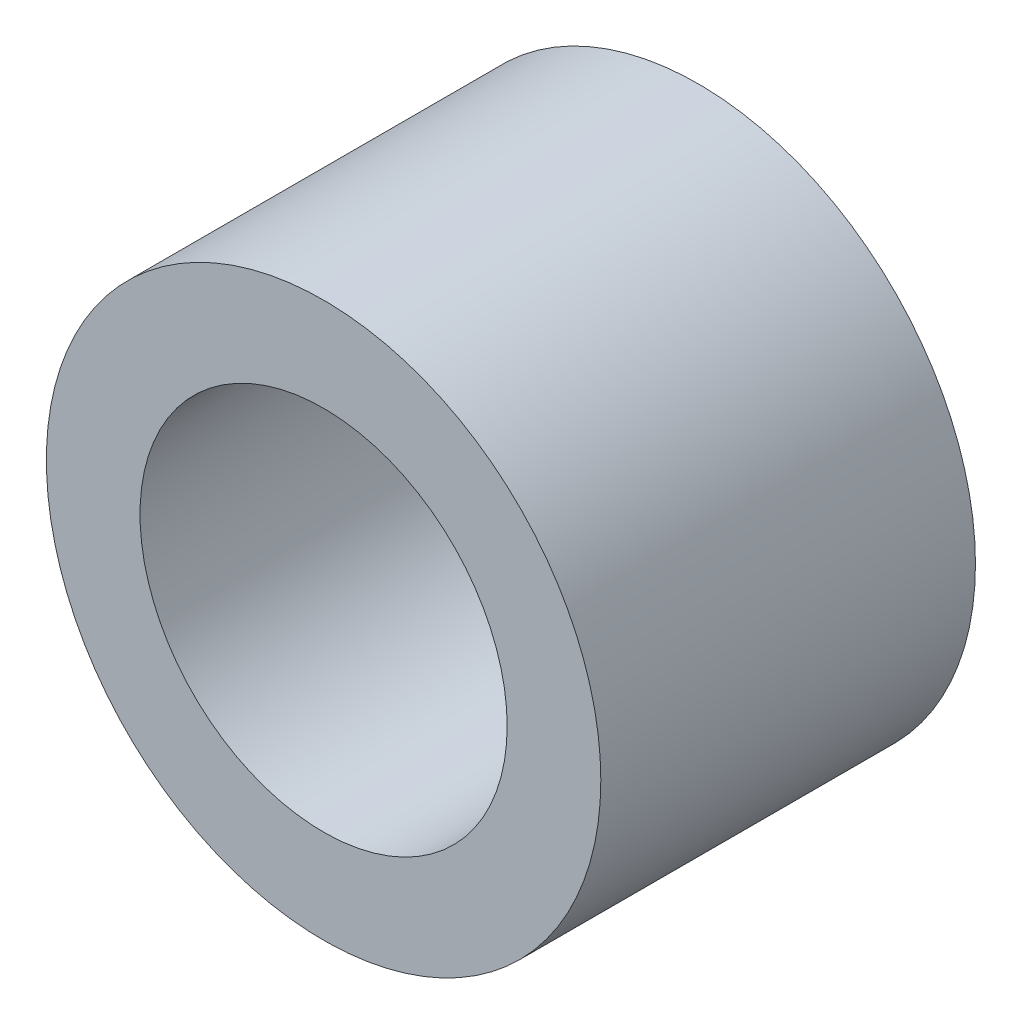
ISO-10303-21;
HEADER;
FILE_DESCRIPTION(('STEP AP214'),'2;1');
FILE_NAME('part.step','',(''),(''),'','','');
FILE_SCHEMA(('AUTOMOTIVE_DESIGN { 1 0 10303 214 1 1 1 1 }'));
ENDSEC;
DATA;
#1=APPLICATION_CONTEXT('core data for automotive mechanical design processes');
#2=APPLICATION_PROTOCOL_DEFINITION('international standard','automotive_design',2000,#1);
#3=PRODUCT_CONTEXT('',#1,'mechanical');
#4=PRODUCT('Part','Part','',(#3));
#5=PRODUCT_RELATED_PRODUCT_CATEGORY('part','',(#4));
#6=PRODUCT_DEFINITION_FORMATION('','',#4);
#7=PRODUCT_DEFINITION_CONTEXT('part definition',#1,'design');
#8=PRODUCT_DEFINITION('design','',#6,#7);
#9=PRODUCT_DEFINITION_SHAPE('','',#8);
#10=(LENGTH_UNIT() NAMED_UNIT(*) SI_UNIT(.MILLI.,.METRE.));
#11=(NAMED_UNIT(*) PLANE_ANGLE_UNIT() SI_UNIT($,.RADIAN.));
#12=(NAMED_UNIT(*) SI_UNIT($,.STERADIAN.) SOLID_ANGLE_UNIT());
#13=UNCERTAINTY_MEASURE_WITH_UNIT(LENGTH_MEASURE(1.E-05),#10,'distance_accuracy_value','');
#14=(GEOMETRIC_REPRESENTATION_CONTEXT(3) GLOBAL_UNCERTAINTY_ASSIGNED_CONTEXT((#13)) GLOBAL_UNIT_ASSIGNED_CONTEXT((#10,
#11,#12)) REPRESENTATION_CONTEXT('',''));
#15=CARTESIAN_POINT('',(0.,0.,0.));
#16=DIRECTION('',(0.,0.,1.));
#17=DIRECTION('',(1.,0.,0.));
#18=AXIS2_PLACEMENT_3D('',#15,#16,#17);
#19=CARTESIAN_POINT('',(0.,18.5,-8.));
#20=DIRECTION('',(0.,0.,-1.));
#21=DIRECTION('',(-1.,0.,0.));
#22=AXIS2_PLACEMENT_3D('',#19,#20,#21);
#23=PLANE('',#22);
#24=CARTESIAN_POINT('',(0.,0.,-8.));
#25=DIRECTION('',(0.,0.,1.));
#26=DIRECTION('',(1.,0.,0.));
#27=AXIS2_PLACEMENT_3D('',#24,#25,#26);
#28=CIRCLE('',#27,12.25);
#29=CARTESIAN_POINT('',(12.25,0.,-8.));
#30=VERTEX_POINT('',#29);
#31=EDGE_CURVE('E11',#30,#30,#28,.T.);
#32=ORIENTED_EDGE('',*,*,#31,.F.);
#33=EDGE_LOOP('',(#32));
#34=FACE_BOUND('',#33,.T.);
#35=CARTESIAN_POINT('',(0.,0.,-8.));
#36=DIRECTION('',(0.,0.,1.));
#37=DIRECTION('',(1.,0.,0.));
#38=AXIS2_PLACEMENT_3D('',#35,#36,#37);
#39=CIRCLE('',#38,18.5);
#40=CARTESIAN_POINT('',(18.5,0.,-8.));
#41=VERTEX_POINT('',#40);
#42=EDGE_CURVE('E65',#41,#41,#39,.T.);
#43=ORIENTED_EDGE('',*,*,#42,.T.);
#44=EDGE_LOOP('',(#43));
#45=FACE_BOUND('',#44,.T.);
#46=ADVANCED_FACE('F51',(#34,#45),#23,.F.);
#47=CARTESIAN_POINT('',(0.,0.,24.4));
#48=DIRECTION('',(0.,0.,1.));
#49=DIRECTION('',(1.,0.,0.));
#50=AXIS2_PLACEMENT_3D('',#47,#48,#49);
#51=CYLINDRICAL_SURFACE('',#50,12.25);
#52=CARTESIAN_POINT('',(0.,0.,-33.));
#53=DIRECTION('',(0.,0.,1.));
#54=DIRECTION('',(1.,0.,0.));
#55=AXIS2_PLACEMENT_3D('',#52,#53,#54);
#56=CIRCLE('',#55,12.25);
#57=CARTESIAN_POINT('',(12.25,0.,-33.));
#58=VERTEX_POINT('',#57);
#59=EDGE_CURVE('E57',#58,#58,#56,.T.);
#60=ORIENTED_EDGE('',*,*,#59,.F.);
#61=EDGE_LOOP('',(#60));
#62=FACE_BOUND('',#61,.T.);
#63=ORIENTED_EDGE('',*,*,#31,.T.);
#64=EDGE_LOOP('',(#63));
#65=FACE_BOUND('',#64,.T.);
#66=ADVANCED_FACE('F80',(#62,#65),#51,.F.);
#67=CARTESIAN_POINT('',(0.,18.5,-33.));
#68=DIRECTION('',(0.,0.,1.));
#69=DIRECTION('',(1.,0.,0.));
#70=AXIS2_PLACEMENT_3D('',#67,#68,#69);
#71=PLANE('',#70);
#72=CARTESIAN_POINT('',(0.,0.,-33.));
#73=DIRECTION('',(0.,0.,1.));
#74=DIRECTION('',(1.,0.,0.));
#75=AXIS2_PLACEMENT_3D('',#72,#73,#74);
#76=CIRCLE('',#75,18.5);
#77=CARTESIAN_POINT('',(18.5,0.,-33.));
#78=VERTEX_POINT('',#77);
#79=EDGE_CURVE('E61',#78,#78,#76,.T.);
#80=ORIENTED_EDGE('',*,*,#79,.F.);
#81=EDGE_LOOP('',(#80));
#82=FACE_BOUND('',#81,.T.);
#83=ORIENTED_EDGE('',*,*,#59,.T.);
#84=EDGE_LOOP('',(#83));
#85=FACE_BOUND('',#84,.T.);
#86=ADVANCED_FACE('F75',(#82,#85),#71,.F.);
#87=CARTESIAN_POINT('',(0.,0.,24.4));
#88=DIRECTION('',(0.,0.,1.));
#89=DIRECTION('',(1.,0.,0.));
#90=AXIS2_PLACEMENT_3D('',#87,#88,#89);
#91=CYLINDRICAL_SURFACE('',#90,18.5);
#92=ORIENTED_EDGE('',*,*,#42,.F.);
#93=EDGE_LOOP('',(#92));
#94=FACE_BOUND('',#93,.T.);
#95=ORIENTED_EDGE('',*,*,#79,.T.);
#96=EDGE_LOOP('',(#95));
#97=FACE_BOUND('',#96,.T.);
#98=ADVANCED_FACE('F72',(#94,#97),#91,.T.);
#99=CLOSED_SHELL('',(#46,#66,#86,#98));
#100=MANIFOLD_SOLID_BREP('B2',#99);
#101=ADVANCED_BREP_SHAPE_REPRESENTATION('',(#18,#100),#14);
#102=SHAPE_DEFINITION_REPRESENTATION(#9,#101);
ENDSEC;
END-ISO-10303-21;
